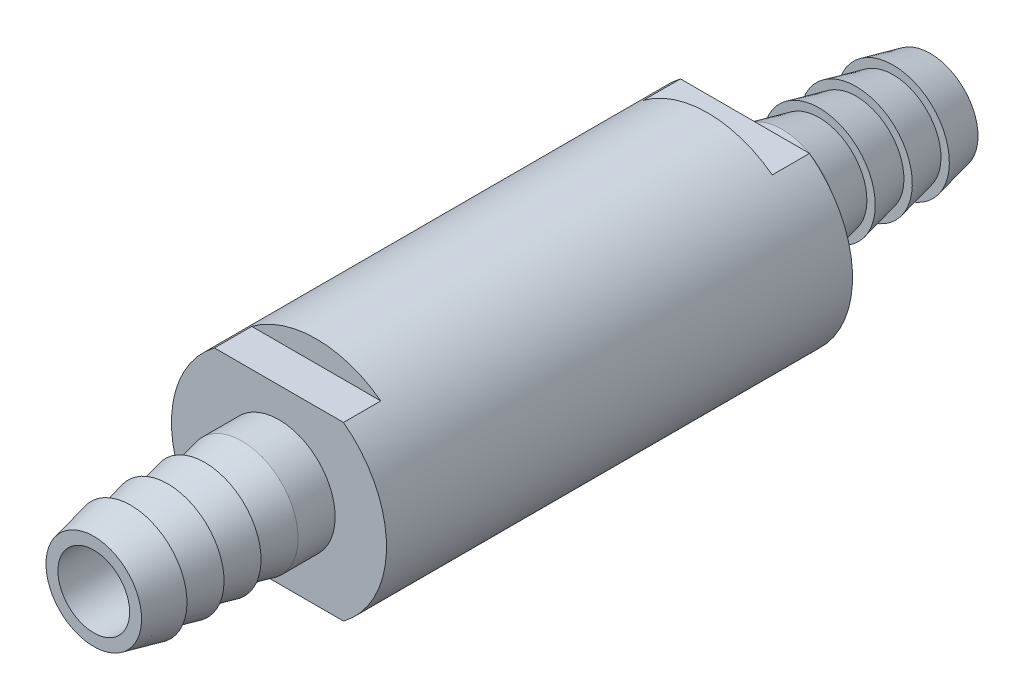
ISO-10303-21;
HEADER;
FILE_DESCRIPTION(('STEP AP214'),'2;1');
FILE_NAME('part.step','',(''),(''),'','','');
FILE_SCHEMA(('AUTOMOTIVE_DESIGN { 1 0 10303 214 1 1 1 1 }'));
ENDSEC;
DATA;
#1=APPLICATION_CONTEXT('core data for automotive mechanical design processes');
#2=APPLICATION_PROTOCOL_DEFINITION('international standard','automotive_design',2000,#1);
#3=PRODUCT_CONTEXT('',#1,'mechanical');
#4=PRODUCT('Part','Part','',(#3));
#5=PRODUCT_RELATED_PRODUCT_CATEGORY('part','',(#4));
#6=PRODUCT_DEFINITION_FORMATION('','',#4);
#7=PRODUCT_DEFINITION_CONTEXT('part definition',#1,'design');
#8=PRODUCT_DEFINITION('design','',#6,#7);
#9=PRODUCT_DEFINITION_SHAPE('','',#8);
#10=(LENGTH_UNIT() NAMED_UNIT(*) SI_UNIT(.MILLI.,.METRE.));
#11=(NAMED_UNIT(*) PLANE_ANGLE_UNIT() SI_UNIT($,.RADIAN.));
#12=(NAMED_UNIT(*) SI_UNIT($,.STERADIAN.) SOLID_ANGLE_UNIT());
#13=UNCERTAINTY_MEASURE_WITH_UNIT(LENGTH_MEASURE(1.E-05),#10,'distance_accuracy_value','');
#14=(GEOMETRIC_REPRESENTATION_CONTEXT(3) GLOBAL_UNCERTAINTY_ASSIGNED_CONTEXT((#13)) GLOBAL_UNIT_ASSIGNED_CONTEXT((#10,
#11,#12)) REPRESENTATION_CONTEXT('',''));
#15=CARTESIAN_POINT('',(0.,0.,0.));
#16=DIRECTION('',(0.,0.,1.));
#17=DIRECTION('',(1.,0.,0.));
#18=AXIS2_PLACEMENT_3D('',#15,#16,#17);
#19=CARTESIAN_POINT('',(0.,0.,-30.95625));
#20=DIRECTION('',(0.,0.,-1.));
#21=DIRECTION('',(0.,1.,0.));
#22=AXIS2_PLACEMENT_3D('',#19,#20,#21);
#23=CYLINDRICAL_SURFACE('',#22,14.2875);
#24=CARTESIAN_POINT('',(0.,0.,-30.95625));
#25=DIRECTION('',(0.,0.,-1.));
#26=DIRECTION('',(0.,1.,0.));
#27=AXIS2_PLACEMENT_3D('',#24,#25,#26);
#28=CIRCLE('',#27,14.2875);
#29=CARTESIAN_POINT('',(-8.57249999999997,-11.43,-30.95625));
#30=VERTEX_POINT('',#29);
#31=CARTESIAN_POINT('',(-8.57249999999999,11.43,-30.95625));
#32=VERTEX_POINT('',#31);
#33=EDGE_CURVE('E162',#30,#32,#28,.T.);
#34=ORIENTED_EDGE('',*,*,#33,.F.);
#35=DIRECTION('',(0.,0.,-1.));
#36=VECTOR('',#35,1.);
#37=CARTESIAN_POINT('',(-8.57249999999999,-11.43,-26.00325));
#38=LINE('',#37,#36);
#39=CARTESIAN_POINT('',(-8.57249999999999,-11.43,-26.00325));
#40=VERTEX_POINT('',#39);
#41=EDGE_CURVE('E139',#40,#30,#38,.T.);
#42=ORIENTED_EDGE('',*,*,#41,.F.);
#43=CARTESIAN_POINT('',(0.,0.,-26.00325));
#44=DIRECTION('',(0.,0.,1.));
#45=DIRECTION('',(0.,-1.,0.));
#46=AXIS2_PLACEMENT_3D('',#43,#44,#45);
#47=CIRCLE('',#46,14.2875);
#48=CARTESIAN_POINT('',(8.57249999999999,-11.43,-26.00325));
#49=VERTEX_POINT('',#48);
#50=EDGE_CURVE('E134',#40,#49,#47,.T.);
#51=ORIENTED_EDGE('',*,*,#50,.T.);
#52=DIRECTION('',(0.,0.,-1.));
#53=VECTOR('',#52,1.);
#54=CARTESIAN_POINT('',(8.57249999999999,-11.43,-26.00325));
#55=LINE('',#54,#53);
#56=CARTESIAN_POINT('',(8.57249999999999,-11.43,-30.95625));
#57=VERTEX_POINT('',#56);
#58=EDGE_CURVE('E142',#49,#57,#55,.T.);
#59=ORIENTED_EDGE('',*,*,#58,.T.);
#60=CARTESIAN_POINT('',(8.57249999999999,11.43,-30.95625));
#61=VERTEX_POINT('',#60);
#62=EDGE_CURVE('E163',#61,#57,#28,.T.);
#63=ORIENTED_EDGE('',*,*,#62,.F.);
#64=DIRECTION('',(0.,0.,-1.));
#65=VECTOR('',#64,1.);
#66=CARTESIAN_POINT('',(8.57249999999999,11.43,-26.00325));
#67=LINE('',#66,#65);
#68=CARTESIAN_POINT('',(8.57249999999999,11.43,-26.00325));
#69=VERTEX_POINT('',#68);
#70=EDGE_CURVE('E152',#69,#61,#67,.T.);
#71=ORIENTED_EDGE('',*,*,#70,.F.);
#72=CARTESIAN_POINT('',(0.,0.,-26.00325));
#73=DIRECTION('',(0.,0.,-1.));
#74=DIRECTION('',(0.,1.,0.));
#75=AXIS2_PLACEMENT_3D('',#72,#73,#74);
#76=CIRCLE('',#75,14.2875);
#77=CARTESIAN_POINT('',(-8.57249999999999,11.43,-26.00325));
#78=VERTEX_POINT('',#77);
#79=EDGE_CURVE('E147',#78,#69,#76,.T.);
#80=ORIENTED_EDGE('',*,*,#79,.F.);
#81=DIRECTION('',(0.,0.,-1.));
#82=VECTOR('',#81,1.);
#83=CARTESIAN_POINT('',(-8.57249999999999,11.43,-26.00325));
#84=LINE('',#83,#82);
#85=EDGE_CURVE('E155',#78,#32,#84,.T.);
#86=ORIENTED_EDGE('',*,*,#85,.T.);
#87=EDGE_LOOP('',(#34,#42,#51,#59,#63,#71,#80,#86));
#88=FACE_BOUND('',#87,.T.);
#89=CARTESIAN_POINT('',(0.,0.,26.00325));
#90=DIRECTION('',(0.,0.,-1.));
#91=DIRECTION('',(0.,1.,0.));
#92=AXIS2_PLACEMENT_3D('',#89,#90,#91);
#93=CIRCLE('',#92,14.2875);
#94=CARTESIAN_POINT('',(-8.57249999999999,11.43,26.00325));
#95=VERTEX_POINT('',#94);
#96=CARTESIAN_POINT('',(8.57249999999999,11.43,26.00325));
#97=VERTEX_POINT('',#96);
#98=EDGE_CURVE('E110',#95,#97,#93,.T.);
#99=ORIENTED_EDGE('',*,*,#98,.T.);
#100=DIRECTION('',(0.,0.,1.));
#101=VECTOR('',#100,1.);
#102=CARTESIAN_POINT('',(8.57249999999999,11.43,26.00325));
#103=LINE('',#102,#101);
#104=CARTESIAN_POINT('',(8.57249999999999,11.43,30.95625));
#105=VERTEX_POINT('',#104);
#106=EDGE_CURVE('E107',#97,#105,#103,.T.);
#107=ORIENTED_EDGE('',*,*,#106,.T.);
#108=CARTESIAN_POINT('',(0.,0.,30.95625));
#109=DIRECTION('',(0.,0.,-1.));
#110=DIRECTION('',(0.,1.,0.));
#111=AXIS2_PLACEMENT_3D('',#108,#109,#110);
#112=CIRCLE('',#111,14.2875);
#113=CARTESIAN_POINT('',(8.57249999999999,-11.43,30.95625));
#114=VERTEX_POINT('',#113);
#115=EDGE_CURVE('E62',#105,#114,#112,.T.);
#116=ORIENTED_EDGE('',*,*,#115,.T.);
#117=DIRECTION('',(0.,0.,1.));
#118=VECTOR('',#117,1.);
#119=CARTESIAN_POINT('',(8.57249999999999,-11.43,26.00325));
#120=LINE('',#119,#118);
#121=CARTESIAN_POINT('',(8.57249999999999,-11.43,26.00325));
#122=VERTEX_POINT('',#121);
#123=EDGE_CURVE('E128',#122,#114,#120,.T.);
#124=ORIENTED_EDGE('',*,*,#123,.F.);
#125=CARTESIAN_POINT('',(0.,0.,26.00325));
#126=DIRECTION('',(0.,0.,1.));
#127=DIRECTION('',(0.,-1.,0.));
#128=AXIS2_PLACEMENT_3D('',#125,#126,#127);
#129=CIRCLE('',#128,14.2875);
#130=CARTESIAN_POINT('',(-8.57249999999999,-11.43,26.00325));
#131=VERTEX_POINT('',#130);
#132=EDGE_CURVE('E123',#131,#122,#129,.T.);
#133=ORIENTED_EDGE('',*,*,#132,.F.);
#134=DIRECTION('',(0.,0.,1.));
#135=VECTOR('',#134,1.);
#136=CARTESIAN_POINT('',(-8.57249999999999,-11.43,26.00325));
#137=LINE('',#136,#135);
#138=CARTESIAN_POINT('',(-8.57249999999999,-11.43,30.95625));
#139=VERTEX_POINT('',#138);
#140=EDGE_CURVE('E130',#131,#139,#137,.T.);
#141=ORIENTED_EDGE('',*,*,#140,.T.);
#142=CARTESIAN_POINT('',(-8.57249999999998,11.43,30.95625));
#143=VERTEX_POINT('',#142);
#144=EDGE_CURVE('E47',#139,#143,#112,.T.);
#145=ORIENTED_EDGE('',*,*,#144,.T.);
#146=DIRECTION('',(0.,0.,1.));
#147=VECTOR('',#146,1.);
#148=CARTESIAN_POINT('',(-8.57249999999999,11.43,26.00325));
#149=LINE('',#148,#147);
#150=EDGE_CURVE('E54',#95,#143,#149,.T.);
#151=ORIENTED_EDGE('',*,*,#150,.F.);
#152=EDGE_LOOP('',(#99,#107,#116,#124,#133,#141,#145,#151));
#153=FACE_BOUND('',#152,.T.);
#154=ADVANCED_FACE('F39',(#88,#153),#23,.T.);
#155=CARTESIAN_POINT('',(0.,7.46124999999999,30.95625));
#156=DIRECTION('',(0.,0.,1.));
#157=DIRECTION('',(0.,-1.,0.));
#158=AXIS2_PLACEMENT_3D('',#155,#156,#157);
#159=PLANE('',#158);
#160=CARTESIAN_POINT('',(0.,0.,30.95625));
#161=DIRECTION('',(0.,0.,-1.));
#162=DIRECTION('',(0.,1.,0.));
#163=AXIS2_PLACEMENT_3D('',#160,#161,#162);
#164=CIRCLE('',#163,7.46124999999999);
#165=CARTESIAN_POINT('',(0.,7.46124999999999,30.95625));
#166=VERTEX_POINT('',#165);
#167=EDGE_CURVE('E11',#166,#166,#164,.T.);
#168=ORIENTED_EDGE('',*,*,#167,.T.);
#169=EDGE_LOOP('',(#168));
#170=FACE_BOUND('',#169,.T.);
#171=ORIENTED_EDGE('',*,*,#115,.F.);
#172=DIRECTION('',(-1.,0.,0.));
#173=VECTOR('',#172,1.);
#174=CARTESIAN_POINT('',(8.57249999999999,11.43,30.95625));
#175=LINE('',#174,#173);
#176=EDGE_CURVE('E113',#105,#143,#175,.T.);
#177=ORIENTED_EDGE('',*,*,#176,.T.);
#178=ORIENTED_EDGE('',*,*,#144,.F.);
#179=DIRECTION('',(-1.,0.,0.));
#180=VECTOR('',#179,1.);
#181=CARTESIAN_POINT('',(8.57249999999999,-11.43,30.95625));
#182=LINE('',#181,#180);
#183=EDGE_CURVE('E119',#114,#139,#182,.T.);
#184=ORIENTED_EDGE('',*,*,#183,.F.);
#185=EDGE_LOOP('',(#171,#177,#178,#184));
#186=FACE_BOUND('',#185,.T.);
#187=ADVANCED_FACE('F192',(#170,#186),#159,.T.);
#188=CARTESIAN_POINT('',(0.,14.2875,-30.95625));
#189=DIRECTION('',(0.,0.,-1.));
#190=DIRECTION('',(0.,1.,0.));
#191=AXIS2_PLACEMENT_3D('',#188,#189,#190);
#192=PLANE('',#191);
#193=CARTESIAN_POINT('',(0.,0.,-30.95625));
#194=DIRECTION('',(0.,0.,-1.));
#195=DIRECTION('',(0.,1.,0.));
#196=AXIS2_PLACEMENT_3D('',#193,#194,#195);
#197=CIRCLE('',#196,7.46124999999998);
#198=CARTESIAN_POINT('',(0.,7.46124999999999,-30.95625));
#199=VERTEX_POINT('',#198);
#200=EDGE_CURVE('E158',#199,#199,#197,.T.);
#201=ORIENTED_EDGE('',*,*,#200,.F.);
#202=EDGE_LOOP('',(#201));
#203=FACE_BOUND('',#202,.T.);
#204=ORIENTED_EDGE('',*,*,#62,.T.);
#205=DIRECTION('',(-1.,0.,0.));
#206=VECTOR('',#205,1.);
#207=CARTESIAN_POINT('',(8.57249999999999,-11.43,-30.95625));
#208=LINE('',#207,#206);
#209=EDGE_CURVE('E132',#57,#30,#208,.T.);
#210=ORIENTED_EDGE('',*,*,#209,.T.);
#211=ORIENTED_EDGE('',*,*,#33,.T.);
#212=DIRECTION('',(-1.,0.,0.));
#213=VECTOR('',#212,1.);
#214=CARTESIAN_POINT('',(8.57249999999999,11.43,-30.95625));
#215=LINE('',#214,#213);
#216=EDGE_CURVE('E145',#61,#32,#215,.T.);
#217=ORIENTED_EDGE('',*,*,#216,.F.);
#218=EDGE_LOOP('',(#204,#210,#211,#217));
#219=FACE_BOUND('',#218,.T.);
#220=ADVANCED_FACE('F169',(#203,#219),#192,.T.);
#221=CARTESIAN_POINT('',(0.,0.,-30.95625));
#222=DIRECTION('',(0.,0.,-1.));
#223=DIRECTION('',(0.,1.,0.));
#224=AXIS2_PLACEMENT_3D('',#221,#222,#223);
#225=CYLINDRICAL_SURFACE('',#224,7.46124999999999);
#226=CARTESIAN_POINT('',(0.,0.,35.8775));
#227=DIRECTION('',(0.,0.,-1.));
#228=DIRECTION('',(0.,1.,0.));
#229=AXIS2_PLACEMENT_3D('',#226,#227,#228);
#230=CIRCLE('',#229,7.46124999999999);
#231=CARTESIAN_POINT('',(0.,7.46124999999999,35.8775));
#232=VERTEX_POINT('',#231);
#233=EDGE_CURVE('E213',#232,#232,#230,.T.);
#234=ORIENTED_EDGE('',*,*,#233,.T.);
#235=EDGE_LOOP('',(#234));
#236=FACE_BOUND('',#235,.T.);
#237=ORIENTED_EDGE('',*,*,#167,.F.);
#238=EDGE_LOOP('',(#237));
#239=FACE_BOUND('',#238,.T.);
#240=ADVANCED_FACE('F201',(#236,#239),#225,.T.);
#241=CARTESIAN_POINT('',(0.,0.,-30.95625));
#242=DIRECTION('',(0.,0.,-1.));
#243=DIRECTION('',(0.,1.,0.));
#244=AXIS2_PLACEMENT_3D('',#241,#242,#243);
#245=CYLINDRICAL_SURFACE('',#244,7.46124999999998);
#246=CARTESIAN_POINT('',(0.,0.,-35.8775));
#247=DIRECTION('',(0.,0.,-1.));
#248=DIRECTION('',(0.,1.,0.));
#249=AXIS2_PLACEMENT_3D('',#246,#247,#248);
#250=CIRCLE('',#249,7.46124999999999);
#251=CARTESIAN_POINT('',(0.,7.46124999999999,-35.8775));
#252=VERTEX_POINT('',#251);
#253=EDGE_CURVE('E492',#252,#252,#250,.T.);
#254=ORIENTED_EDGE('',*,*,#253,.F.);
#255=EDGE_LOOP('',(#254));
#256=FACE_BOUND('',#255,.T.);
#257=ORIENTED_EDGE('',*,*,#200,.T.);
#258=EDGE_LOOP('',(#257));
#259=FACE_BOUND('',#258,.T.);
#260=ADVANCED_FACE('F189',(#256,#259),#245,.T.);
#261=CARTESIAN_POINT('',(8.57249999999999,11.43,-26.00325));
#262=DIRECTION('',(0.,-1.,0.));
#263=DIRECTION('',(0.,0.,-1.));
#264=AXIS2_PLACEMENT_3D('',#261,#262,#263);
#265=PLANE('',#264);
#266=ORIENTED_EDGE('',*,*,#216,.T.);
#267=ORIENTED_EDGE('',*,*,#85,.F.);
#268=DIRECTION('',(-1.,0.,0.));
#269=VECTOR('',#268,1.);
#270=CARTESIAN_POINT('',(8.57249999999999,11.43,-26.00325));
#271=LINE('',#270,#269);
#272=EDGE_CURVE('E149',#69,#78,#271,.T.);
#273=ORIENTED_EDGE('',*,*,#272,.F.);
#274=ORIENTED_EDGE('',*,*,#70,.T.);
#275=EDGE_LOOP('',(#266,#267,#273,#274));
#276=FACE_BOUND('',#275,.T.);
#277=ADVANCED_FACE('F173',(#276),#265,.F.);
#278=CARTESIAN_POINT('',(0.,0.,-26.00325));
#279=DIRECTION('',(0.,0.,-1.));
#280=DIRECTION('',(0.,1.,0.));
#281=AXIS2_PLACEMENT_3D('',#278,#279,#280);
#282=PLANE('',#281);
#283=ORIENTED_EDGE('',*,*,#79,.T.);
#284=ORIENTED_EDGE('',*,*,#272,.T.);
#285=EDGE_LOOP('',(#283,#284));
#286=FACE_BOUND('',#285,.T.);
#287=ADVANCED_FACE('F178',(#286),#282,.T.);
#288=CARTESIAN_POINT('',(8.57249999999999,-11.43,-26.00325));
#289=DIRECTION('',(0.,-1.,0.));
#290=DIRECTION('',(0.,0.,-1.));
#291=AXIS2_PLACEMENT_3D('',#288,#289,#290);
#292=PLANE('',#291);
#293=ORIENTED_EDGE('',*,*,#209,.F.);
#294=ORIENTED_EDGE('',*,*,#58,.F.);
#295=DIRECTION('',(-1.,0.,0.));
#296=VECTOR('',#295,1.);
#297=CARTESIAN_POINT('',(8.57249999999999,-11.43,-26.00325));
#298=LINE('',#297,#296);
#299=EDGE_CURVE('E137',#49,#40,#298,.T.);
#300=ORIENTED_EDGE('',*,*,#299,.T.);
#301=ORIENTED_EDGE('',*,*,#41,.T.);
#302=EDGE_LOOP('',(#293,#294,#300,#301));
#303=FACE_BOUND('',#302,.T.);
#304=ADVANCED_FACE('F180',(#303),#292,.T.);
#305=CARTESIAN_POINT('',(0.,0.,-26.00325));
#306=DIRECTION('',(0.,0.,-1.));
#307=DIRECTION('',(0.,-1.,0.));
#308=AXIS2_PLACEMENT_3D('',#305,#306,#307);
#309=PLANE('',#308);
#310=ORIENTED_EDGE('',*,*,#50,.F.);
#311=ORIENTED_EDGE('',*,*,#299,.F.);
#312=EDGE_LOOP('',(#310,#311));
#313=FACE_BOUND('',#312,.T.);
#314=ADVANCED_FACE('F186',(#313),#309,.T.);
#315=CARTESIAN_POINT('',(8.57249999999999,-11.43,26.00325));
#316=DIRECTION('',(0.,1.,0.));
#317=DIRECTION('',(0.,0.,1.));
#318=AXIS2_PLACEMENT_3D('',#315,#316,#317);
#319=PLANE('',#318);
#320=ORIENTED_EDGE('',*,*,#183,.T.);
#321=ORIENTED_EDGE('',*,*,#140,.F.);
#322=DIRECTION('',(-1.,0.,0.));
#323=VECTOR('',#322,1.);
#324=CARTESIAN_POINT('',(8.57249999999999,-11.43,26.00325));
#325=LINE('',#324,#323);
#326=EDGE_CURVE('E125',#122,#131,#325,.T.);
#327=ORIENTED_EDGE('',*,*,#326,.F.);
#328=ORIENTED_EDGE('',*,*,#123,.T.);
#329=EDGE_LOOP('',(#320,#321,#327,#328));
#330=FACE_BOUND('',#329,.T.);
#331=ADVANCED_FACE('F218',(#330),#319,.F.);
#332=CARTESIAN_POINT('',(0.,0.,26.00325));
#333=DIRECTION('',(0.,0.,1.));
#334=DIRECTION('',(0.,-1.,0.));
#335=AXIS2_PLACEMENT_3D('',#332,#333,#334);
#336=PLANE('',#335);
#337=ORIENTED_EDGE('',*,*,#132,.T.);
#338=ORIENTED_EDGE('',*,*,#326,.T.);
#339=EDGE_LOOP('',(#337,#338));
#340=FACE_BOUND('',#339,.T.);
#341=ADVANCED_FACE('F222',(#340),#336,.T.);
#342=CARTESIAN_POINT('',(8.57249999999999,11.43,26.00325));
#343=DIRECTION('',(0.,1.,0.));
#344=DIRECTION('',(0.,0.,1.));
#345=AXIS2_PLACEMENT_3D('',#342,#343,#344);
#346=PLANE('',#345);
#347=ORIENTED_EDGE('',*,*,#176,.F.);
#348=ORIENTED_EDGE('',*,*,#106,.F.);
#349=DIRECTION('',(-1.,0.,0.));
#350=VECTOR('',#349,1.);
#351=CARTESIAN_POINT('',(8.57249999999999,11.43,26.00325));
#352=LINE('',#351,#350);
#353=EDGE_CURVE('E104',#97,#95,#352,.T.);
#354=ORIENTED_EDGE('',*,*,#353,.T.);
#355=ORIENTED_EDGE('',*,*,#150,.T.);
#356=EDGE_LOOP('',(#347,#348,#354,#355));
#357=FACE_BOUND('',#356,.T.);
#358=ADVANCED_FACE('F106',(#357),#346,.T.);
#359=CARTESIAN_POINT('',(0.,0.,26.00325));
#360=DIRECTION('',(0.,0.,1.));
#361=DIRECTION('',(0.,1.,0.));
#362=AXIS2_PLACEMENT_3D('',#359,#360,#361);
#363=PLANE('',#362);
#364=ORIENTED_EDGE('',*,*,#98,.F.);
#365=ORIENTED_EDGE('',*,*,#353,.F.);
#366=EDGE_LOOP('',(#364,#365));
#367=FACE_BOUND('',#366,.T.);
#368=ADVANCED_FACE('F112',(#367),#363,.T.);
#369=CARTESIAN_POINT('',(0.,7.46124999999999,40.79875));
#370=DIRECTION('',(0.,0.,1.));
#371=DIRECTION('',(0.,-1.,0.));
#372=AXIS2_PLACEMENT_3D('',#369,#370,#371);
#373=PLANE('',#372);
#374=CARTESIAN_POINT('',(0.,0.,40.79875));
#375=DIRECTION('',(0.,0.,-1.));
#376=DIRECTION('',(0.,1.,0.));
#377=AXIS2_PLACEMENT_3D('',#374,#375,#376);
#378=CIRCLE('',#377,6.34999999999999);
#379=CARTESIAN_POINT('',(0.,6.34999999999999,40.79875));
#380=VERTEX_POINT('',#379);
#381=EDGE_CURVE('E518',#380,#380,#378,.T.);
#382=ORIENTED_EDGE('',*,*,#381,.F.);
#383=EDGE_LOOP('',(#382));
#384=FACE_BOUND('',#383,.T.);
#385=CARTESIAN_POINT('',(0.,0.,40.79875));
#386=DIRECTION('',(0.,0.,-1.));
#387=DIRECTION('',(0.,1.,0.));
#388=AXIS2_PLACEMENT_3D('',#385,#386,#387);
#389=CIRCLE('',#388,7.46124999999999);
#390=CARTESIAN_POINT('',(0.,7.46124999999999,40.79875));
#391=VERTEX_POINT('',#390);
#392=EDGE_CURVE('E521',#391,#391,#389,.T.);
#393=ORIENTED_EDGE('',*,*,#392,.T.);
#394=EDGE_LOOP('',(#393));
#395=FACE_BOUND('',#394,.T.);
#396=ADVANCED_FACE('F268',(#384,#395),#373,.F.);
#397=CARTESIAN_POINT('',(0.,0.,40.79875));
#398=DIRECTION('',(0.,0.,-1.));
#399=DIRECTION('',(0.,1.,0.));
#400=AXIS2_PLACEMENT_3D('',#397,#398,#399);
#401=CONICAL_SURFACE('',#400,6.34999999999999,0.22208190190548);
#402=ORIENTED_EDGE('',*,*,#233,.F.);
#403=EDGE_LOOP('',(#402));
#404=FACE_BOUND('',#403,.T.);
#405=ORIENTED_EDGE('',*,*,#381,.T.);
#406=EDGE_LOOP('',(#405));
#407=FACE_BOUND('',#406,.T.);
#408=ADVANCED_FACE('F295',(#404,#407),#401,.T.);
#409=CARTESIAN_POINT('',(0.,0.,55.5625));
#410=DIRECTION('',(0.,0.,1.));
#411=DIRECTION('',(0.,-1.,0.));
#412=AXIS2_PLACEMENT_3D('',#409,#410,#411);
#413=PLANE('',#412);
#414=CARTESIAN_POINT('',(0.,0.,55.5625));
#415=DIRECTION('',(0.,0.,1.));
#416=DIRECTION('',(1.,0.,0.));
#417=AXIS2_PLACEMENT_3D('',#414,#415,#416);
#418=CIRCLE('',#417,4.7625);
#419=CARTESIAN_POINT('',(4.7625,0.,55.5625));
#420=VERTEX_POINT('',#419);
#421=EDGE_CURVE('E482',#420,#420,#418,.T.);
#422=ORIENTED_EDGE('',*,*,#421,.F.);
#423=EDGE_LOOP('',(#422));
#424=FACE_BOUND('',#423,.T.);
#425=CARTESIAN_POINT('',(0.,0.,55.5625));
#426=DIRECTION('',(0.,0.,-1.));
#427=DIRECTION('',(0.,1.,0.));
#428=AXIS2_PLACEMENT_3D('',#425,#426,#427);
#429=CIRCLE('',#428,6.34999999999999);
#430=CARTESIAN_POINT('',(0.,6.34999999999999,55.5625));
#431=VERTEX_POINT('',#430);
#432=EDGE_CURVE('E536',#431,#431,#429,.T.);
#433=ORIENTED_EDGE('',*,*,#432,.F.);
#434=EDGE_LOOP('',(#433));
#435=FACE_BOUND('',#434,.T.);
#436=ADVANCED_FACE('F41',(#424,#435),#413,.T.);
#437=CARTESIAN_POINT('',(0.,0.,55.5625));
#438=DIRECTION('',(0.,0.,-1.));
#439=DIRECTION('',(0.,1.,0.));
#440=AXIS2_PLACEMENT_3D('',#437,#438,#439);
#441=CONICAL_SURFACE('',#440,6.34999999999999,0.22208190190548);
#442=CARTESIAN_POINT('',(0.,0.,50.64125));
#443=DIRECTION('',(0.,0.,-1.));
#444=DIRECTION('',(0.,1.,0.));
#445=AXIS2_PLACEMENT_3D('',#442,#443,#444);
#446=CIRCLE('',#445,7.46124999999999);
#447=CARTESIAN_POINT('',(0.,7.46124999999999,50.64125));
#448=VERTEX_POINT('',#447);
#449=EDGE_CURVE('E533',#448,#448,#446,.T.);
#450=ORIENTED_EDGE('',*,*,#449,.F.);
#451=EDGE_LOOP('',(#450));
#452=FACE_BOUND('',#451,.T.);
#453=ORIENTED_EDGE('',*,*,#432,.T.);
#454=EDGE_LOOP('',(#453));
#455=FACE_BOUND('',#454,.T.);
#456=ADVANCED_FACE('F274',(#452,#455),#441,.T.);
#457=CARTESIAN_POINT('',(0.,7.46124999999999,50.64125));
#458=DIRECTION('',(0.,0.,1.));
#459=DIRECTION('',(0.,-1.,0.));
#460=AXIS2_PLACEMENT_3D('',#457,#458,#459);
#461=PLANE('',#460);
#462=CARTESIAN_POINT('',(0.,0.,50.64125));
#463=DIRECTION('',(0.,0.,-1.));
#464=DIRECTION('',(0.,1.,0.));
#465=AXIS2_PLACEMENT_3D('',#462,#463,#464);
#466=CIRCLE('',#465,6.34999999999999);
#467=CARTESIAN_POINT('',(0.,6.34999999999999,50.64125));
#468=VERTEX_POINT('',#467);
#469=EDGE_CURVE('E530',#468,#468,#466,.T.);
#470=ORIENTED_EDGE('',*,*,#469,.F.);
#471=EDGE_LOOP('',(#470));
#472=FACE_BOUND('',#471,.T.);
#473=ORIENTED_EDGE('',*,*,#449,.T.);
#474=EDGE_LOOP('',(#473));
#475=FACE_BOUND('',#474,.T.);
#476=ADVANCED_FACE('F278',(#472,#475),#461,.F.);
#477=CARTESIAN_POINT('',(0.,0.,50.64125));
#478=DIRECTION('',(0.,0.,-1.));
#479=DIRECTION('',(0.,1.,0.));
#480=AXIS2_PLACEMENT_3D('',#477,#478,#479);
#481=CONICAL_SURFACE('',#480,6.34999999999999,0.22208190190548);
#482=CARTESIAN_POINT('',(0.,0.,45.72));
#483=DIRECTION('',(0.,0.,-1.));
#484=DIRECTION('',(0.,1.,0.));
#485=AXIS2_PLACEMENT_3D('',#482,#483,#484);
#486=CIRCLE('',#485,7.46124999999999);
#487=CARTESIAN_POINT('',(0.,7.46124999999999,45.72));
#488=VERTEX_POINT('',#487);
#489=EDGE_CURVE('E527',#488,#488,#486,.T.);
#490=ORIENTED_EDGE('',*,*,#489,.F.);
#491=EDGE_LOOP('',(#490));
#492=FACE_BOUND('',#491,.T.);
#493=ORIENTED_EDGE('',*,*,#469,.T.);
#494=EDGE_LOOP('',(#493));
#495=FACE_BOUND('',#494,.T.);
#496=ADVANCED_FACE('F313',(#492,#495),#481,.T.);
#497=CARTESIAN_POINT('',(0.,7.46124999999999,45.72));
#498=DIRECTION('',(0.,0.,1.));
#499=DIRECTION('',(0.,-1.,0.));
#500=AXIS2_PLACEMENT_3D('',#497,#498,#499);
#501=PLANE('',#500);
#502=CARTESIAN_POINT('',(0.,0.,45.72));
#503=DIRECTION('',(0.,0.,-1.));
#504=DIRECTION('',(0.,1.,0.));
#505=AXIS2_PLACEMENT_3D('',#502,#503,#504);
#506=CIRCLE('',#505,6.34999999999999);
#507=CARTESIAN_POINT('',(0.,6.34999999999999,45.72));
#508=VERTEX_POINT('',#507);
#509=EDGE_CURVE('E524',#508,#508,#506,.T.);
#510=ORIENTED_EDGE('',*,*,#509,.F.);
#511=EDGE_LOOP('',(#510));
#512=FACE_BOUND('',#511,.T.);
#513=ORIENTED_EDGE('',*,*,#489,.T.);
#514=EDGE_LOOP('',(#513));
#515=FACE_BOUND('',#514,.T.);
#516=ADVANCED_FACE('F323',(#512,#515),#501,.F.);
#517=CARTESIAN_POINT('',(0.,0.,45.72));
#518=DIRECTION('',(0.,0.,-1.));
#519=DIRECTION('',(0.,1.,0.));
#520=AXIS2_PLACEMENT_3D('',#517,#518,#519);
#521=CONICAL_SURFACE('',#520,6.34999999999999,0.22208190190548);
#522=ORIENTED_EDGE('',*,*,#392,.F.);
#523=EDGE_LOOP('',(#522));
#524=FACE_BOUND('',#523,.T.);
#525=ORIENTED_EDGE('',*,*,#509,.T.);
#526=EDGE_LOOP('',(#525));
#527=FACE_BOUND('',#526,.T.);
#528=ADVANCED_FACE('F333',(#524,#527),#521,.T.);
#529=CARTESIAN_POINT('',(0.,7.46124999999999,-40.79875));
#530=DIRECTION('',(0.,0.,-1.));
#531=DIRECTION('',(0.,-1.,0.));
#532=AXIS2_PLACEMENT_3D('',#529,#530,#531);
#533=PLANE('',#532);
#534=CARTESIAN_POINT('',(0.,0.,-40.79875));
#535=DIRECTION('',(0.,0.,-1.));
#536=DIRECTION('',(0.,1.,0.));
#537=AXIS2_PLACEMENT_3D('',#534,#535,#536);
#538=CIRCLE('',#537,6.34999999999999);
#539=CARTESIAN_POINT('',(0.,6.34999999999999,-40.79875));
#540=VERTEX_POINT('',#539);
#541=EDGE_CURVE('E496',#540,#540,#538,.T.);
#542=ORIENTED_EDGE('',*,*,#541,.T.);
#543=EDGE_LOOP('',(#542));
#544=FACE_BOUND('',#543,.T.);
#545=CARTESIAN_POINT('',(0.,0.,-40.79875));
#546=DIRECTION('',(0.,0.,-1.));
#547=DIRECTION('',(0.,1.,0.));
#548=AXIS2_PLACEMENT_3D('',#545,#546,#547);
#549=CIRCLE('',#548,7.46124999999999);
#550=CARTESIAN_POINT('',(0.,7.46124999999999,-40.79875));
#551=VERTEX_POINT('',#550);
#552=EDGE_CURVE('E499',#551,#551,#549,.T.);
#553=ORIENTED_EDGE('',*,*,#552,.F.);
#554=EDGE_LOOP('',(#553));
#555=FACE_BOUND('',#554,.T.);
#556=ADVANCED_FACE('F343',(#544,#555),#533,.F.);
#557=CARTESIAN_POINT('',(0.,0.,-40.79875));
#558=DIRECTION('',(0.,0.,1.));
#559=DIRECTION('',(0.,1.,0.));
#560=AXIS2_PLACEMENT_3D('',#557,#558,#559);
#561=CONICAL_SURFACE('',#560,6.34999999999999,0.22208190190548);
#562=ORIENTED_EDGE('',*,*,#253,.T.);
#563=EDGE_LOOP('',(#562));
#564=FACE_BOUND('',#563,.T.);
#565=ORIENTED_EDGE('',*,*,#541,.F.);
#566=EDGE_LOOP('',(#565));
#567=FACE_BOUND('',#566,.T.);
#568=ADVANCED_FACE('F360',(#564,#567),#561,.T.);
#569=CARTESIAN_POINT('',(0.,7.46124999999999,-55.5625));
#570=DIRECTION('',(0.,0.,-1.));
#571=DIRECTION('',(0.,1.,0.));
#572=AXIS2_PLACEMENT_3D('',#569,#570,#571);
#573=PLANE('',#572);
#574=CARTESIAN_POINT('',(0.,0.,-55.5625));
#575=DIRECTION('',(0.,0.,1.));
#576=DIRECTION('',(1.,0.,0.));
#577=AXIS2_PLACEMENT_3D('',#574,#575,#576);
#578=CIRCLE('',#577,4.7625);
#579=CARTESIAN_POINT('',(4.7625,0.,-55.5625));
#580=VERTEX_POINT('',#579);
#581=EDGE_CURVE('E483',#580,#580,#578,.T.);
#582=ORIENTED_EDGE('',*,*,#581,.T.);
#583=EDGE_LOOP('',(#582));
#584=FACE_BOUND('',#583,.T.);
#585=CARTESIAN_POINT('',(0.,0.,-55.5625));
#586=DIRECTION('',(0.,0.,-1.));
#587=DIRECTION('',(0.,1.,0.));
#588=AXIS2_PLACEMENT_3D('',#585,#586,#587);
#589=CIRCLE('',#588,6.34999999999999);
#590=CARTESIAN_POINT('',(0.,6.34999999999999,-55.5625));
#591=VERTEX_POINT('',#590);
#592=EDGE_CURVE('E514',#591,#591,#589,.T.);
#593=ORIENTED_EDGE('',*,*,#592,.T.);
#594=EDGE_LOOP('',(#593));
#595=FACE_BOUND('',#594,.T.);
#596=ADVANCED_FACE('F370',(#584,#595),#573,.T.);
#597=CARTESIAN_POINT('',(0.,0.,-55.5625));
#598=DIRECTION('',(0.,0.,1.));
#599=DIRECTION('',(0.,1.,0.));
#600=AXIS2_PLACEMENT_3D('',#597,#598,#599);
#601=CONICAL_SURFACE('',#600,6.34999999999999,0.22208190190548);
#602=CARTESIAN_POINT('',(0.,0.,-50.64125));
#603=DIRECTION('',(0.,0.,-1.));
#604=DIRECTION('',(0.,1.,0.));
#605=AXIS2_PLACEMENT_3D('',#602,#603,#604);
#606=CIRCLE('',#605,7.46124999999999);
#607=CARTESIAN_POINT('',(0.,7.46124999999999,-50.64125));
#608=VERTEX_POINT('',#607);
#609=EDGE_CURVE('E511',#608,#608,#606,.T.);
#610=ORIENTED_EDGE('',*,*,#609,.T.);
#611=EDGE_LOOP('',(#610));
#612=FACE_BOUND('',#611,.T.);
#613=ORIENTED_EDGE('',*,*,#592,.F.);
#614=EDGE_LOOP('',(#613));
#615=FACE_BOUND('',#614,.T.);
#616=ADVANCED_FACE('F378',(#612,#615),#601,.T.);
#617=CARTESIAN_POINT('',(0.,7.46124999999999,-50.64125));
#618=DIRECTION('',(0.,0.,-1.));
#619=DIRECTION('',(0.,-1.,0.));
#620=AXIS2_PLACEMENT_3D('',#617,#618,#619);
#621=PLANE('',#620);
#622=CARTESIAN_POINT('',(0.,0.,-50.64125));
#623=DIRECTION('',(0.,0.,-1.));
#624=DIRECTION('',(0.,1.,0.));
#625=AXIS2_PLACEMENT_3D('',#622,#623,#624);
#626=CIRCLE('',#625,6.34999999999999);
#627=CARTESIAN_POINT('',(0.,6.34999999999999,-50.64125));
#628=VERTEX_POINT('',#627);
#629=EDGE_CURVE('E508',#628,#628,#626,.T.);
#630=ORIENTED_EDGE('',*,*,#629,.T.);
#631=EDGE_LOOP('',(#630));
#632=FACE_BOUND('',#631,.T.);
#633=ORIENTED_EDGE('',*,*,#609,.F.);
#634=EDGE_LOOP('',(#633));
#635=FACE_BOUND('',#634,.T.);
#636=ADVANCED_FACE('F382',(#632,#635),#621,.F.);
#637=CARTESIAN_POINT('',(0.,0.,-50.64125));
#638=DIRECTION('',(0.,0.,1.));
#639=DIRECTION('',(0.,1.,0.));
#640=AXIS2_PLACEMENT_3D('',#637,#638,#639);
#641=CONICAL_SURFACE('',#640,6.34999999999999,0.22208190190548);
#642=CARTESIAN_POINT('',(0.,0.,-45.72));
#643=DIRECTION('',(0.,0.,-1.));
#644=DIRECTION('',(0.,1.,0.));
#645=AXIS2_PLACEMENT_3D('',#642,#643,#644);
#646=CIRCLE('',#645,7.46124999999999);
#647=CARTESIAN_POINT('',(0.,7.46124999999999,-45.72));
#648=VERTEX_POINT('',#647);
#649=EDGE_CURVE('E505',#648,#648,#646,.T.);
#650=ORIENTED_EDGE('',*,*,#649,.T.);
#651=EDGE_LOOP('',(#650));
#652=FACE_BOUND('',#651,.T.);
#653=ORIENTED_EDGE('',*,*,#629,.F.);
#654=EDGE_LOOP('',(#653));
#655=FACE_BOUND('',#654,.T.);
#656=ADVANCED_FACE('F392',(#652,#655),#641,.T.);
#657=CARTESIAN_POINT('',(0.,7.46124999999999,-45.72));
#658=DIRECTION('',(0.,0.,-1.));
#659=DIRECTION('',(0.,-1.,0.));
#660=AXIS2_PLACEMENT_3D('',#657,#658,#659);
#661=PLANE('',#660);
#662=CARTESIAN_POINT('',(0.,0.,-45.72));
#663=DIRECTION('',(0.,0.,-1.));
#664=DIRECTION('',(0.,1.,0.));
#665=AXIS2_PLACEMENT_3D('',#662,#663,#664);
#666=CIRCLE('',#665,6.34999999999999);
#667=CARTESIAN_POINT('',(0.,6.34999999999999,-45.72));
#668=VERTEX_POINT('',#667);
#669=EDGE_CURVE('E502',#668,#668,#666,.T.);
#670=ORIENTED_EDGE('',*,*,#669,.T.);
#671=EDGE_LOOP('',(#670));
#672=FACE_BOUND('',#671,.T.);
#673=ORIENTED_EDGE('',*,*,#649,.F.);
#674=EDGE_LOOP('',(#673));
#675=FACE_BOUND('',#674,.T.);
#676=ADVANCED_FACE('F402',(#672,#675),#661,.F.);
#677=CARTESIAN_POINT('',(0.,0.,-45.72));
#678=DIRECTION('',(0.,0.,1.));
#679=DIRECTION('',(0.,1.,0.));
#680=AXIS2_PLACEMENT_3D('',#677,#678,#679);
#681=CONICAL_SURFACE('',#680,6.34999999999999,0.22208190190548);
#682=ORIENTED_EDGE('',*,*,#552,.T.);
#683=EDGE_LOOP('',(#682));
#684=FACE_BOUND('',#683,.T.);
#685=ORIENTED_EDGE('',*,*,#669,.F.);
#686=EDGE_LOOP('',(#685));
#687=FACE_BOUND('',#686,.T.);
#688=ADVANCED_FACE('F412',(#684,#687),#681,.T.);
#689=CARTESIAN_POINT('',(0.,0.,30.95625));
#690=DIRECTION('',(0.,0.,1.));
#691=DIRECTION('',(1.,0.,0.));
#692=AXIS2_PLACEMENT_3D('',#689,#690,#691);
#693=CYLINDRICAL_SURFACE('',#692,4.7625);
#694=CARTESIAN_POINT('',(0.,0.,30.95625));
#695=DIRECTION('',(0.,0.,1.));
#696=DIRECTION('',(1.,0.,0.));
#697=AXIS2_PLACEMENT_3D('',#694,#695,#696);
#698=CIRCLE('',#697,4.7625);
#699=CARTESIAN_POINT('',(4.7625,0.,30.95625));
#700=VERTEX_POINT('',#699);
#701=EDGE_CURVE('E486',#700,#700,#698,.T.);
#702=ORIENTED_EDGE('',*,*,#701,.F.);
#703=EDGE_LOOP('',(#702));
#704=FACE_BOUND('',#703,.T.);
#705=ORIENTED_EDGE('',*,*,#421,.T.);
#706=EDGE_LOOP('',(#705));
#707=FACE_BOUND('',#706,.T.);
#708=ADVANCED_FACE('F422',(#704,#707),#693,.F.);
#709=CARTESIAN_POINT('',(0.,0.,30.95625));
#710=DIRECTION('',(0.,0.,1.));
#711=DIRECTION('',(1.,0.,0.));
#712=AXIS2_PLACEMENT_3D('',#709,#710,#711);
#713=PLANE('',#712);
#714=ORIENTED_EDGE('',*,*,#701,.T.);
#715=EDGE_LOOP('',(#714));
#716=FACE_BOUND('',#715,.T.);
#717=ADVANCED_FACE('F438',(#716),#713,.T.);
#718=CARTESIAN_POINT('',(0.,0.,-30.95625));
#719=DIRECTION('',(0.,0.,-1.));
#720=DIRECTION('',(-1.,0.,0.));
#721=AXIS2_PLACEMENT_3D('',#718,#719,#720);
#722=CYLINDRICAL_SURFACE('',#721,4.7625);
#723=CARTESIAN_POINT('',(0.,0.,-30.95625));
#724=DIRECTION('',(0.,0.,1.));
#725=DIRECTION('',(1.,0.,0.));
#726=AXIS2_PLACEMENT_3D('',#723,#724,#725);
#727=CIRCLE('',#726,4.7625);
#728=CARTESIAN_POINT('',(4.7625,0.,-30.95625));
#729=VERTEX_POINT('',#728);
#730=EDGE_CURVE('E481',#729,#729,#727,.T.);
#731=ORIENTED_EDGE('',*,*,#730,.T.);
#732=EDGE_LOOP('',(#731));
#733=FACE_BOUND('',#732,.T.);
#734=ORIENTED_EDGE('',*,*,#581,.F.);
#735=EDGE_LOOP('',(#734));
#736=FACE_BOUND('',#735,.T.);
#737=ADVANCED_FACE('F448',(#733,#736),#722,.F.);
#738=CARTESIAN_POINT('',(0.,0.,-30.95625));
#739=DIRECTION('',(0.,0.,-1.));
#740=DIRECTION('',(1.,0.,0.));
#741=AXIS2_PLACEMENT_3D('',#738,#739,#740);
#742=PLANE('',#741);
#743=ORIENTED_EDGE('',*,*,#730,.F.);
#744=EDGE_LOOP('',(#743));
#745=FACE_BOUND('',#744,.T.);
#746=ADVANCED_FACE('F465',(#745),#742,.T.);
#747=CLOSED_SHELL('',(#154,#187,#220,#240,#260,#277,#287,#304,#314,#331,#341,#358,#368,#396,
#408,#436,#456,#476,#496,#516,#528,#556,#568,#596,#616,#636,#656,#676,#688,#708,#717,#737,#746));
#748=MANIFOLD_SOLID_BREP('B2',#747);
#749=ADVANCED_BREP_SHAPE_REPRESENTATION('',(#18,#748),#14);
#750=SHAPE_DEFINITION_REPRESENTATION(#9,#749);
ENDSEC;
END-ISO-10303-21;
